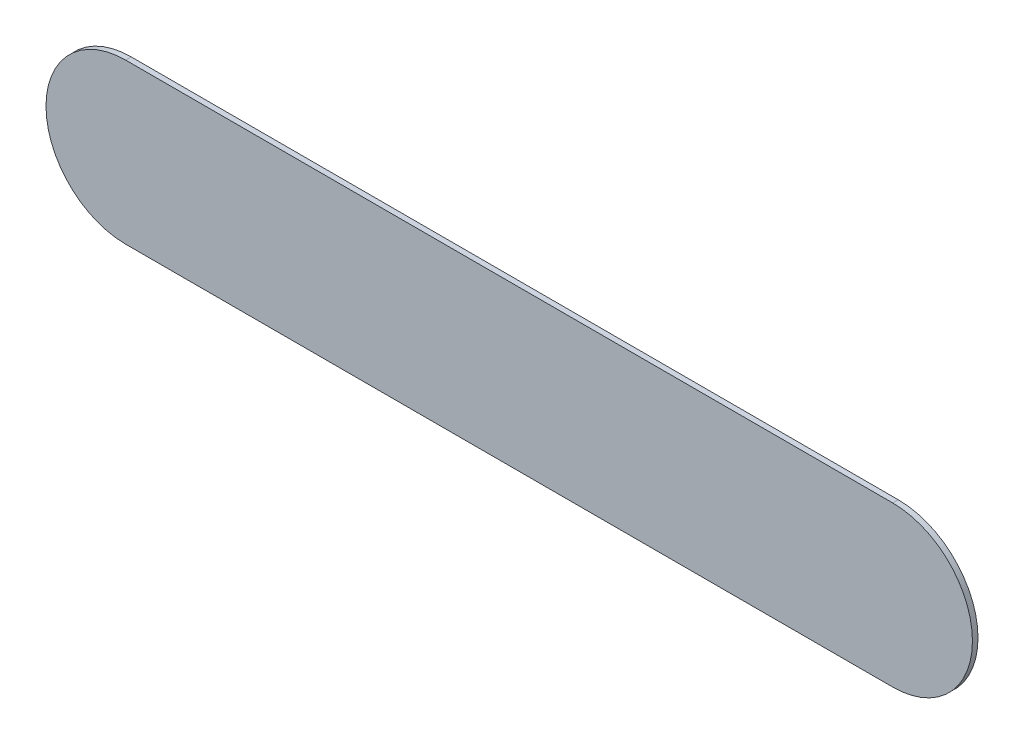
ISO-10303-21;
HEADER;
FILE_DESCRIPTION(('STEP AP214'),'2;1');
FILE_NAME('part.step','',(''),(''),'','','');
FILE_SCHEMA(('AUTOMOTIVE_DESIGN { 1 0 10303 214 1 1 1 1 }'));
ENDSEC;
DATA;
#1=APPLICATION_CONTEXT('core data for automotive mechanical design processes');
#2=APPLICATION_PROTOCOL_DEFINITION('international standard','automotive_design',2000,#1);
#3=PRODUCT_CONTEXT('',#1,'mechanical');
#4=PRODUCT('Part','Part','',(#3));
#5=PRODUCT_RELATED_PRODUCT_CATEGORY('part','',(#4));
#6=PRODUCT_DEFINITION_FORMATION('','',#4);
#7=PRODUCT_DEFINITION_CONTEXT('part definition',#1,'design');
#8=PRODUCT_DEFINITION('design','',#6,#7);
#9=PRODUCT_DEFINITION_SHAPE('','',#8);
#10=(LENGTH_UNIT() NAMED_UNIT(*) SI_UNIT(.MILLI.,.METRE.));
#11=(NAMED_UNIT(*) PLANE_ANGLE_UNIT() SI_UNIT($,.RADIAN.));
#12=(NAMED_UNIT(*) SI_UNIT($,.STERADIAN.) SOLID_ANGLE_UNIT());
#13=UNCERTAINTY_MEASURE_WITH_UNIT(LENGTH_MEASURE(1.E-05),#10,'distance_accuracy_value','');
#14=(GEOMETRIC_REPRESENTATION_CONTEXT(3) GLOBAL_UNCERTAINTY_ASSIGNED_CONTEXT((#13)) GLOBAL_UNIT_ASSIGNED_CONTEXT((#10,
#11,#12)) REPRESENTATION_CONTEXT('',''));
#15=CARTESIAN_POINT('',(0.,0.,0.));
#16=DIRECTION('',(0.,0.,1.));
#17=DIRECTION('',(1.,0.,0.));
#18=AXIS2_PLACEMENT_3D('',#15,#16,#17);
#19=CARTESIAN_POINT('',(0.,0.,-0.65));
#20=DIRECTION('',(0.,0.,1.));
#21=DIRECTION('',(1.,0.,0.));
#22=AXIS2_PLACEMENT_3D('',#19,#20,#21);
#23=PLANE('',#22);
#24=DIRECTION('',(1.,0.,0.));
#25=VECTOR('',#24,1.);
#26=CARTESIAN_POINT('',(-38.,-7.9,-0.65));
#27=LINE('',#26,#25);
#28=CARTESIAN_POINT('',(-38.,-7.9,-0.65));
#29=VERTEX_POINT('',#28);
#30=CARTESIAN_POINT('',(38.,-7.9,-0.65));
#31=VERTEX_POINT('',#30);
#32=EDGE_CURVE('E11',#29,#31,#27,.T.);
#33=ORIENTED_EDGE('',*,*,#32,.F.);
#34=CARTESIAN_POINT('',(-38.,0.,-0.65));
#35=DIRECTION('',(0.,0.,1.));
#36=DIRECTION('',(0.,1.,0.));
#37=AXIS2_PLACEMENT_3D('',#34,#35,#36);
#38=CIRCLE('',#37,7.9);
#39=CARTESIAN_POINT('',(-38.,7.9,-0.65));
#40=VERTEX_POINT('',#39);
#41=EDGE_CURVE('E47',#40,#29,#38,.T.);
#42=ORIENTED_EDGE('',*,*,#41,.F.);
#43=DIRECTION('',(-1.,0.,0.));
#44=VECTOR('',#43,1.);
#45=CARTESIAN_POINT('',(38.,7.9,-0.65));
#46=LINE('',#45,#44);
#47=CARTESIAN_POINT('',(38.,7.9,-0.65));
#48=VERTEX_POINT('',#47);
#49=EDGE_CURVE('E84',#48,#40,#46,.T.);
#50=ORIENTED_EDGE('',*,*,#49,.F.);
#51=CARTESIAN_POINT('',(38.,0.,-0.65));
#52=DIRECTION('',(0.,0.,1.));
#53=DIRECTION('',(0.,-1.,0.));
#54=AXIS2_PLACEMENT_3D('',#51,#52,#53);
#55=CIRCLE('',#54,7.9);
#56=EDGE_CURVE('E105',#31,#48,#55,.T.);
#57=ORIENTED_EDGE('',*,*,#56,.F.);
#58=EDGE_LOOP('',(#33,#42,#50,#57));
#59=FACE_BOUND('',#58,.T.);
#60=ADVANCED_FACE('F17',(#59),#23,.F.);
#61=CARTESIAN_POINT('',(-38.,-7.9,-0.1));
#62=DIRECTION('',(0.,-1.,0.));
#63=DIRECTION('',(0.,0.,-1.));
#64=AXIS2_PLACEMENT_3D('',#61,#62,#63);
#65=PLANE('',#64);
#66=DIRECTION('',(0.,0.,-1.));
#67=VECTOR('',#66,1.);
#68=CARTESIAN_POINT('',(-38.,-7.9,-0.1));
#69=LINE('',#68,#67);
#70=CARTESIAN_POINT('',(-38.,-7.9,-0.1));
#71=VERTEX_POINT('',#70);
#72=EDGE_CURVE('E21',#71,#29,#69,.T.);
#73=ORIENTED_EDGE('',*,*,#72,.T.);
#74=ORIENTED_EDGE('',*,*,#32,.T.);
#75=DIRECTION('',(0.,0.,-1.));
#76=VECTOR('',#75,1.);
#77=CARTESIAN_POINT('',(38.,-7.9,-0.1));
#78=LINE('',#77,#76);
#79=CARTESIAN_POINT('',(38.,-7.9,-0.1));
#80=VERTEX_POINT('',#79);
#81=EDGE_CURVE('E65',#80,#31,#78,.T.);
#82=ORIENTED_EDGE('',*,*,#81,.F.);
#83=DIRECTION('',(1.,0.,0.));
#84=VECTOR('',#83,1.);
#85=CARTESIAN_POINT('',(-38.,-7.9,-0.1));
#86=LINE('',#85,#84);
#87=EDGE_CURVE('E92',#71,#80,#86,.T.);
#88=ORIENTED_EDGE('',*,*,#87,.F.);
#89=EDGE_LOOP('',(#73,#74,#82,#88));
#90=FACE_BOUND('',#89,.T.);
#91=ADVANCED_FACE('F123',(#90),#65,.T.);
#92=CARTESIAN_POINT('',(-38.,0.,-0.1));
#93=DIRECTION('',(0.,0.,1.));
#94=DIRECTION('',(1.,0.,0.));
#95=AXIS2_PLACEMENT_3D('',#92,#93,#94);
#96=CYLINDRICAL_SURFACE('',#95,7.9);
#97=DIRECTION('',(0.,0.,-1.));
#98=VECTOR('',#97,1.);
#99=CARTESIAN_POINT('',(-38.,7.9,-0.1));
#100=LINE('',#99,#98);
#101=CARTESIAN_POINT('',(-38.,7.9,-0.1));
#102=VERTEX_POINT('',#101);
#103=EDGE_CURVE('E79',#102,#40,#100,.T.);
#104=ORIENTED_EDGE('',*,*,#103,.T.);
#105=ORIENTED_EDGE('',*,*,#41,.T.);
#106=ORIENTED_EDGE('',*,*,#72,.F.);
#107=CARTESIAN_POINT('',(-38.,0.,-0.1));
#108=DIRECTION('',(0.,0.,1.));
#109=DIRECTION('',(0.,1.,0.));
#110=AXIS2_PLACEMENT_3D('',#107,#108,#109);
#111=CIRCLE('',#110,7.9);
#112=EDGE_CURVE('E88',#102,#71,#111,.T.);
#113=ORIENTED_EDGE('',*,*,#112,.F.);
#114=EDGE_LOOP('',(#104,#105,#106,#113));
#115=FACE_BOUND('',#114,.T.);
#116=ADVANCED_FACE('F19',(#115),#96,.T.);
#117=CARTESIAN_POINT('',(38.,7.9,-0.1));
#118=DIRECTION('',(0.,1.,0.));
#119=DIRECTION('',(1.,0.,0.));
#120=AXIS2_PLACEMENT_3D('',#117,#118,#119);
#121=PLANE('',#120);
#122=DIRECTION('',(0.,0.,-1.));
#123=VECTOR('',#122,1.);
#124=CARTESIAN_POINT('',(38.,7.9,-0.1));
#125=LINE('',#124,#123);
#126=CARTESIAN_POINT('',(38.,7.9,-0.1));
#127=VERTEX_POINT('',#126);
#128=EDGE_CURVE('E108',#127,#48,#125,.T.);
#129=ORIENTED_EDGE('',*,*,#128,.T.);
#130=ORIENTED_EDGE('',*,*,#49,.T.);
#131=ORIENTED_EDGE('',*,*,#103,.F.);
#132=DIRECTION('',(-1.,0.,0.));
#133=VECTOR('',#132,1.);
#134=CARTESIAN_POINT('',(38.,7.9,-0.1));
#135=LINE('',#134,#133);
#136=EDGE_CURVE('E83',#127,#102,#135,.T.);
#137=ORIENTED_EDGE('',*,*,#136,.F.);
#138=EDGE_LOOP('',(#129,#130,#131,#137));
#139=FACE_BOUND('',#138,.T.);
#140=ADVANCED_FACE('F81',(#139),#121,.T.);
#141=CARTESIAN_POINT('',(38.,0.,-0.1));
#142=DIRECTION('',(0.,0.,1.));
#143=DIRECTION('',(1.,0.,0.));
#144=AXIS2_PLACEMENT_3D('',#141,#142,#143);
#145=CYLINDRICAL_SURFACE('',#144,7.9);
#146=ORIENTED_EDGE('',*,*,#81,.T.);
#147=ORIENTED_EDGE('',*,*,#56,.T.);
#148=ORIENTED_EDGE('',*,*,#128,.F.);
#149=CARTESIAN_POINT('',(38.,0.,-0.1));
#150=DIRECTION('',(0.,0.,1.));
#151=DIRECTION('',(0.,-1.,0.));
#152=AXIS2_PLACEMENT_3D('',#149,#150,#151);
#153=CIRCLE('',#152,7.9);
#154=EDGE_CURVE('E96',#80,#127,#153,.T.);
#155=ORIENTED_EDGE('',*,*,#154,.F.);
#156=EDGE_LOOP('',(#146,#147,#148,#155));
#157=FACE_BOUND('',#156,.T.);
#158=ADVANCED_FACE('F139',(#157),#145,.T.);
#159=CARTESIAN_POINT('',(0.,0.,-0.1));
#160=DIRECTION('',(0.,0.,1.));
#161=DIRECTION('',(1.,0.,0.));
#162=AXIS2_PLACEMENT_3D('',#159,#160,#161);
#163=PLANE('',#162);
#164=ORIENTED_EDGE('',*,*,#136,.T.);
#165=ORIENTED_EDGE('',*,*,#112,.T.);
#166=ORIENTED_EDGE('',*,*,#87,.T.);
#167=ORIENTED_EDGE('',*,*,#154,.T.);
#168=EDGE_LOOP('',(#164,#165,#166,#167));
#169=FACE_BOUND('',#168,.T.);
#170=ADVANCED_FACE('F95',(#169),#163,.T.);
#171=CLOSED_SHELL('',(#60,#91,#116,#140,#158,#170));
#172=MANIFOLD_SOLID_BREP('B1',#171);
#173=ADVANCED_BREP_SHAPE_REPRESENTATION('',(#18,#172),#14);
#174=SHAPE_DEFINITION_REPRESENTATION(#9,#173);
ENDSEC;
END-ISO-10303-21;
